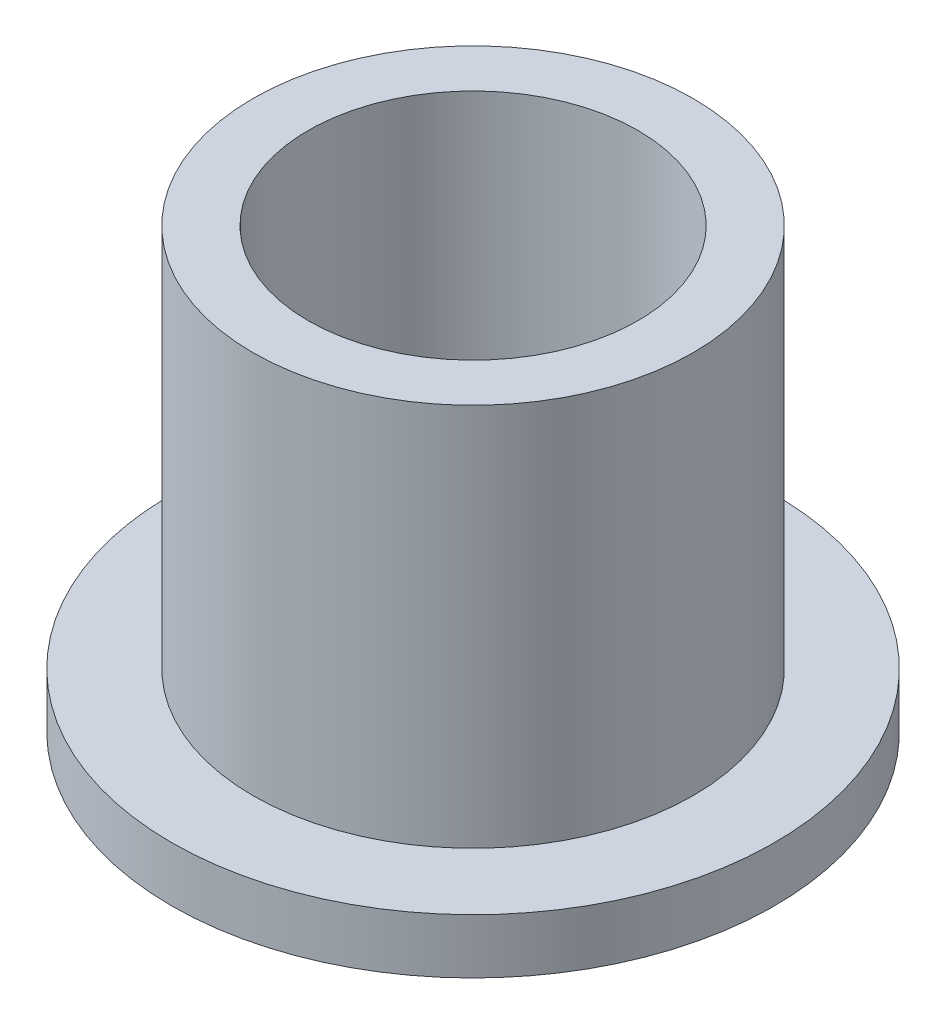
ISO-10303-21;
HEADER;
FILE_DESCRIPTION(('STEP AP214'),'2;1');
FILE_NAME('part.step','',(''),(''),'','','');
FILE_SCHEMA(('AUTOMOTIVE_DESIGN { 1 0 10303 214 1 1 1 1 }'));
ENDSEC;
DATA;
#1=APPLICATION_CONTEXT('core data for automotive mechanical design processes');
#2=APPLICATION_PROTOCOL_DEFINITION('international standard','automotive_design',2000,#1);
#3=PRODUCT_CONTEXT('',#1,'mechanical');
#4=PRODUCT('Part','Part','',(#3));
#5=PRODUCT_RELATED_PRODUCT_CATEGORY('part','',(#4));
#6=PRODUCT_DEFINITION_FORMATION('','',#4);
#7=PRODUCT_DEFINITION_CONTEXT('part definition',#1,'design');
#8=PRODUCT_DEFINITION('design','',#6,#7);
#9=PRODUCT_DEFINITION_SHAPE('','',#8);
#10=(LENGTH_UNIT() NAMED_UNIT(*) SI_UNIT(.MILLI.,.METRE.));
#11=(NAMED_UNIT(*) PLANE_ANGLE_UNIT() SI_UNIT($,.RADIAN.));
#12=(NAMED_UNIT(*) SI_UNIT($,.STERADIAN.) SOLID_ANGLE_UNIT());
#13=UNCERTAINTY_MEASURE_WITH_UNIT(LENGTH_MEASURE(1.E-05),#10,'distance_accuracy_value','');
#14=(GEOMETRIC_REPRESENTATION_CONTEXT(3) GLOBAL_UNCERTAINTY_ASSIGNED_CONTEXT((#13)) GLOBAL_UNIT_ASSIGNED_CONTEXT((#10,
#11,#12)) REPRESENTATION_CONTEXT('',''));
#15=CARTESIAN_POINT('',(0.,0.,0.));
#16=DIRECTION('',(0.,0.,1.));
#17=DIRECTION('',(1.,0.,0.));
#18=AXIS2_PLACEMENT_3D('',#15,#16,#17);
#19=CARTESIAN_POINT('',(0.,12.7,0.));
#20=DIRECTION('',(0.,1.,0.));
#21=DIRECTION('',(0.,0.,1.));
#22=AXIS2_PLACEMENT_3D('',#19,#20,#21);
#23=PLANE('',#22);
#24=CARTESIAN_POINT('',(0.,12.7,0.));
#25=DIRECTION('',(0.,1.,0.));
#26=DIRECTION('',(0.,0.,1.));
#27=AXIS2_PLACEMENT_3D('',#24,#25,#26);
#28=CIRCLE('',#27,6.3754);
#29=CARTESIAN_POINT('',(0.,12.7,6.3754));
#30=VERTEX_POINT('',#29);
#31=EDGE_CURVE('E10',#30,#30,#28,.T.);
#32=ORIENTED_EDGE('',*,*,#31,.T.);
#33=EDGE_LOOP('',(#32));
#34=FACE_BOUND('',#33,.T.);
#35=CARTESIAN_POINT('',(0.,12.7,0.));
#36=DIRECTION('',(0.,1.,0.));
#37=DIRECTION('',(0.,0.,1.));
#38=AXIS2_PLACEMENT_3D('',#35,#36,#37);
#39=CIRCLE('',#38,4.7752);
#40=CARTESIAN_POINT('',(0.,12.7,4.7752));
#41=VERTEX_POINT('',#40);
#42=EDGE_CURVE('E39',#41,#41,#39,.T.);
#43=ORIENTED_EDGE('',*,*,#42,.F.);
#44=EDGE_LOOP('',(#43));
#45=FACE_BOUND('',#44,.T.);
#46=ADVANCED_FACE('F32',(#34,#45),#23,.T.);
#47=CARTESIAN_POINT('',(0.,0.,0.));
#48=DIRECTION('',(0.,1.,0.));
#49=DIRECTION('',(0.,0.,1.));
#50=AXIS2_PLACEMENT_3D('',#47,#48,#49);
#51=PLANE('',#50);
#52=CARTESIAN_POINT('',(0.,0.,0.));
#53=DIRECTION('',(0.,1.,0.));
#54=DIRECTION('',(0.,0.,1.));
#55=AXIS2_PLACEMENT_3D('',#52,#53,#54);
#56=CIRCLE('',#55,4.7752);
#57=CARTESIAN_POINT('',(0.,0.,4.7752));
#58=VERTEX_POINT('',#57);
#59=EDGE_CURVE('E43',#58,#58,#56,.T.);
#60=ORIENTED_EDGE('',*,*,#59,.T.);
#61=EDGE_LOOP('',(#60));
#62=FACE_BOUND('',#61,.T.);
#63=CARTESIAN_POINT('',(0.,0.,0.));
#64=DIRECTION('',(0.,1.,0.));
#65=DIRECTION('',(0.,0.,1.));
#66=AXIS2_PLACEMENT_3D('',#63,#64,#65);
#67=CIRCLE('',#66,8.73125);
#68=CARTESIAN_POINT('',(0.,0.,8.73125));
#69=VERTEX_POINT('',#68);
#70=EDGE_CURVE('E50',#69,#69,#67,.T.);
#71=ORIENTED_EDGE('',*,*,#70,.F.);
#72=EDGE_LOOP('',(#71));
#73=FACE_BOUND('',#72,.T.);
#74=ADVANCED_FACE('F75',(#62,#73),#51,.F.);
#75=CARTESIAN_POINT('',(0.,12.7,0.));
#76=DIRECTION('',(0.,-1.,0.));
#77=DIRECTION('',(0.,0.,-1.));
#78=AXIS2_PLACEMENT_3D('',#75,#76,#77);
#79=CYLINDRICAL_SURFACE('',#78,6.3754);
#80=CARTESIAN_POINT('',(0.,1.5875,0.));
#81=DIRECTION('',(0.,1.,0.));
#82=DIRECTION('',(0.,0.,1.));
#83=AXIS2_PLACEMENT_3D('',#80,#81,#82);
#84=CIRCLE('',#83,6.3754);
#85=CARTESIAN_POINT('',(0.,1.5875,6.3754));
#86=VERTEX_POINT('',#85);
#87=EDGE_CURVE('E53',#86,#86,#84,.T.);
#88=ORIENTED_EDGE('',*,*,#87,.T.);
#89=EDGE_LOOP('',(#88));
#90=FACE_BOUND('',#89,.T.);
#91=ORIENTED_EDGE('',*,*,#31,.F.);
#92=EDGE_LOOP('',(#91));
#93=FACE_BOUND('',#92,.T.);
#94=ADVANCED_FACE('F34',(#90,#93),#79,.T.);
#95=CARTESIAN_POINT('',(0.,12.7,0.));
#96=DIRECTION('',(0.,-1.,0.));
#97=DIRECTION('',(0.,0.,-1.));
#98=AXIS2_PLACEMENT_3D('',#95,#96,#97);
#99=CYLINDRICAL_SURFACE('',#98,4.7752);
#100=ORIENTED_EDGE('',*,*,#42,.T.);
#101=EDGE_LOOP('',(#100));
#102=FACE_BOUND('',#101,.T.);
#103=ORIENTED_EDGE('',*,*,#59,.F.);
#104=EDGE_LOOP('',(#103));
#105=FACE_BOUND('',#104,.T.);
#106=ADVANCED_FACE('F64',(#102,#105),#99,.F.);
#107=CARTESIAN_POINT('',(0.,1.5875,0.));
#108=DIRECTION('',(0.,1.,0.));
#109=DIRECTION('',(0.,0.,1.));
#110=AXIS2_PLACEMENT_3D('',#107,#108,#109);
#111=PLANE('',#110);
#112=CARTESIAN_POINT('',(0.,1.5875,0.));
#113=DIRECTION('',(0.,1.,0.));
#114=DIRECTION('',(0.,0.,1.));
#115=AXIS2_PLACEMENT_3D('',#112,#113,#114);
#116=CIRCLE('',#115,8.73125);
#117=CARTESIAN_POINT('',(0.,1.5875,8.73125));
#118=VERTEX_POINT('',#117);
#119=EDGE_CURVE('E48',#118,#118,#116,.T.);
#120=ORIENTED_EDGE('',*,*,#119,.T.);
#121=EDGE_LOOP('',(#120));
#122=FACE_BOUND('',#121,.T.);
#123=ORIENTED_EDGE('',*,*,#87,.F.);
#124=EDGE_LOOP('',(#123));
#125=FACE_BOUND('',#124,.T.);
#126=ADVANCED_FACE('F61',(#122,#125),#111,.T.);
#127=CARTESIAN_POINT('',(0.,1.5875,0.));
#128=DIRECTION('',(0.,-1.,0.));
#129=DIRECTION('',(0.,0.,-1.));
#130=AXIS2_PLACEMENT_3D('',#127,#128,#129);
#131=CYLINDRICAL_SURFACE('',#130,8.73125);
#132=ORIENTED_EDGE('',*,*,#119,.F.);
#133=EDGE_LOOP('',(#132));
#134=FACE_BOUND('',#133,.T.);
#135=ORIENTED_EDGE('',*,*,#70,.T.);
#136=EDGE_LOOP('',(#135));
#137=FACE_BOUND('',#136,.T.);
#138=ADVANCED_FACE('F63',(#134,#137),#131,.T.);
#139=CLOSED_SHELL('',(#46,#74,#94,#106,#126,#138));
#140=MANIFOLD_SOLID_BREP('B2',#139);
#141=ADVANCED_BREP_SHAPE_REPRESENTATION('',(#18,#140),#14);
#142=SHAPE_DEFINITION_REPRESENTATION(#9,#141);
ENDSEC;
END-ISO-10303-21;
